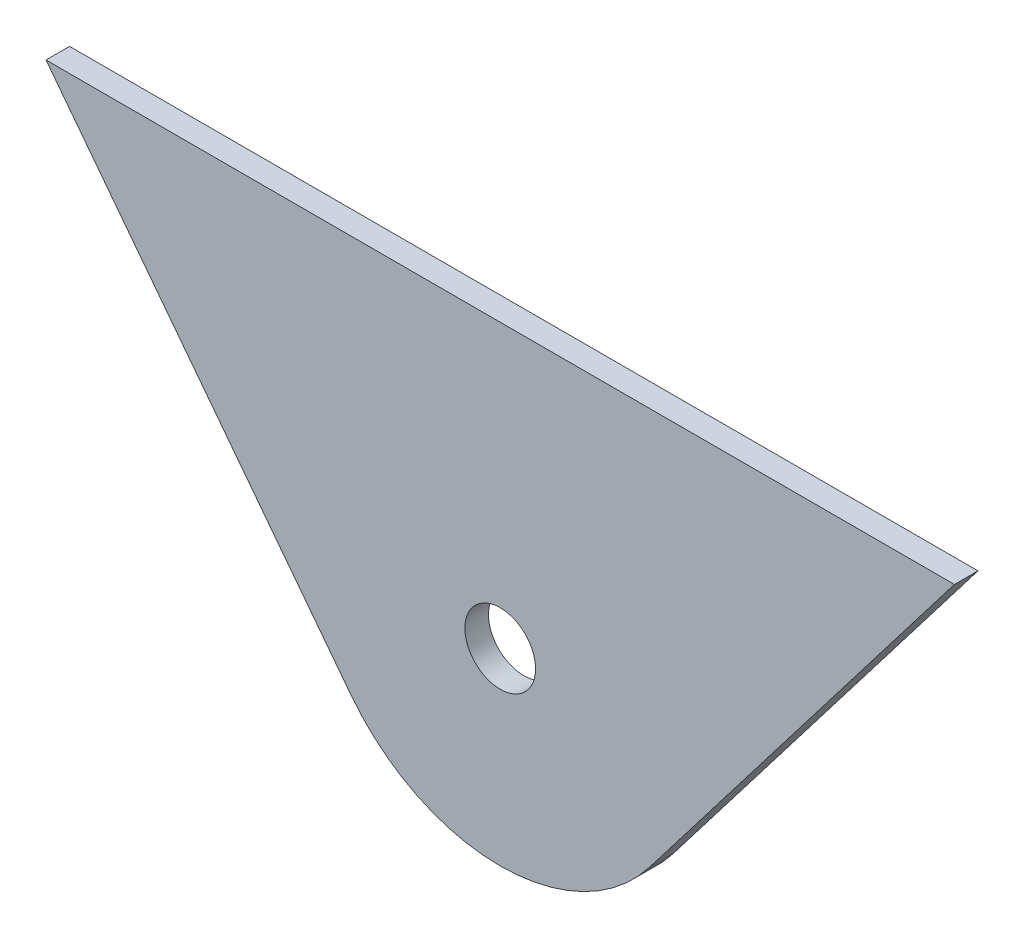
ISO-10303-21;
HEADER;
FILE_DESCRIPTION(('STEP AP214'),'2;1');
FILE_NAME('part.step','',(''),(''),'','','');
FILE_SCHEMA(('AUTOMOTIVE_DESIGN { 1 0 10303 214 1 1 1 1 }'));
ENDSEC;
DATA;
#1=APPLICATION_CONTEXT('core data for automotive mechanical design processes');
#2=APPLICATION_PROTOCOL_DEFINITION('international standard','automotive_design',2000,#1);
#3=PRODUCT_CONTEXT('',#1,'mechanical');
#4=PRODUCT('Part','Part','',(#3));
#5=PRODUCT_RELATED_PRODUCT_CATEGORY('part','',(#4));
#6=PRODUCT_DEFINITION_FORMATION('','',#4);
#7=PRODUCT_DEFINITION_CONTEXT('part definition',#1,'design');
#8=PRODUCT_DEFINITION('design','',#6,#7);
#9=PRODUCT_DEFINITION_SHAPE('','',#8);
#10=(LENGTH_UNIT() NAMED_UNIT(*) SI_UNIT(.MILLI.,.METRE.));
#11=(NAMED_UNIT(*) PLANE_ANGLE_UNIT() SI_UNIT($,.RADIAN.));
#12=(NAMED_UNIT(*) SI_UNIT($,.STERADIAN.) SOLID_ANGLE_UNIT());
#13=UNCERTAINTY_MEASURE_WITH_UNIT(LENGTH_MEASURE(1.E-05),#10,'distance_accuracy_value','');
#14=(GEOMETRIC_REPRESENTATION_CONTEXT(3) GLOBAL_UNCERTAINTY_ASSIGNED_CONTEXT((#13)) GLOBAL_UNIT_ASSIGNED_CONTEXT((#10,
#11,#12)) REPRESENTATION_CONTEXT('',''));
#15=CARTESIAN_POINT('',(0.,0.,0.));
#16=DIRECTION('',(0.,0.,1.));
#17=DIRECTION('',(1.,0.,0.));
#18=AXIS2_PLACEMENT_3D('',#15,#16,#17);
#19=CARTESIAN_POINT('',(0.,0.,3.175));
#20=DIRECTION('',(0.,0.,-1.));
#21=DIRECTION('',(-1.,0.,0.));
#22=AXIS2_PLACEMENT_3D('',#19,#20,#21);
#23=CYLINDRICAL_SURFACE('',#22,25.4);
#24=CARTESIAN_POINT('',(0.,0.,0.));
#25=DIRECTION('',(0.,0.,1.));
#26=DIRECTION('',(1.,0.,0.));
#27=AXIS2_PLACEMENT_3D('',#24,#25,#26);
#28=CIRCLE('',#27,25.4);
#29=CARTESIAN_POINT('',(-20.1511748433974,-15.4625402968215,0.));
#30=VERTEX_POINT('',#29);
#31=CARTESIAN_POINT('',(20.1511748433974,-15.4625402968215,0.));
#32=VERTEX_POINT('',#31);
#33=EDGE_CURVE('E98',#30,#32,#28,.T.);
#34=ORIENTED_EDGE('',*,*,#33,.T.);
#35=DIRECTION('',(0.,0.,-1.));
#36=VECTOR('',#35,1.);
#37=CARTESIAN_POINT('',(20.1511748433974,-15.4625402968215,3.175));
#38=LINE('',#37,#36);
#39=CARTESIAN_POINT('',(20.1511748433974,-15.4625402968215,3.175));
#40=VERTEX_POINT('',#39);
#41=EDGE_CURVE('E11',#40,#32,#38,.T.);
#42=ORIENTED_EDGE('',*,*,#41,.F.);
#43=CARTESIAN_POINT('',(0.,0.,3.175));
#44=DIRECTION('',(0.,0.,1.));
#45=DIRECTION('',(1.,0.,0.));
#46=AXIS2_PLACEMENT_3D('',#43,#44,#45);
#47=CIRCLE('',#46,25.4);
#48=CARTESIAN_POINT('',(-20.1511748433974,-15.4625402968215,3.175));
#49=VERTEX_POINT('',#48);
#50=EDGE_CURVE('E86',#49,#40,#47,.T.);
#51=ORIENTED_EDGE('',*,*,#50,.F.);
#52=DIRECTION('',(0.,0.,-1.));
#53=VECTOR('',#52,1.);
#54=CARTESIAN_POINT('',(-20.1511748433974,-15.4625402968215,3.175));
#55=LINE('',#54,#53);
#56=EDGE_CURVE('E94',#49,#30,#55,.T.);
#57=ORIENTED_EDGE('',*,*,#56,.T.);
#58=EDGE_LOOP('',(#34,#42,#51,#57));
#59=FACE_BOUND('',#58,.T.);
#60=ADVANCED_FACE('F35',(#59),#23,.T.);
#61=CARTESIAN_POINT('',(61.251157557859,38.1,3.175));
#62=DIRECTION('',(-0.793353340291236,0.608761429008719,0.));
#63=DIRECTION('',(-0.608761429008719,-0.793353340291236,0.));
#64=AXIS2_PLACEMENT_3D('',#61,#62,#63);
#65=PLANE('',#64);
#66=DIRECTION('',(0.608761429008719,0.793353340291236,0.));
#67=VECTOR('',#66,1.);
#68=CARTESIAN_POINT('',(61.251157557859,38.1,0.));
#69=LINE('',#68,#67);
#70=CARTESIAN_POINT('',(61.251157557859,38.1,0.));
#71=VERTEX_POINT('',#70);
#72=EDGE_CURVE('E90',#32,#71,#69,.T.);
#73=ORIENTED_EDGE('',*,*,#72,.T.);
#74=DIRECTION('',(0.,0.,-1.));
#75=VECTOR('',#74,1.);
#76=CARTESIAN_POINT('',(61.251157557859,38.1,3.175));
#77=LINE('',#76,#75);
#78=CARTESIAN_POINT('',(61.251157557859,38.1,3.175));
#79=VERTEX_POINT('',#78);
#80=EDGE_CURVE('E43',#79,#71,#77,.T.);
#81=ORIENTED_EDGE('',*,*,#80,.F.);
#82=DIRECTION('',(0.608761429008719,0.793353340291236,0.));
#83=VECTOR('',#82,1.);
#84=CARTESIAN_POINT('',(61.251157557859,38.1,3.175));
#85=LINE('',#84,#83);
#86=EDGE_CURVE('E81',#40,#79,#85,.T.);
#87=ORIENTED_EDGE('',*,*,#86,.F.);
#88=ORIENTED_EDGE('',*,*,#41,.T.);
#89=EDGE_LOOP('',(#73,#81,#87,#88));
#90=FACE_BOUND('',#89,.T.);
#91=ADVANCED_FACE('F89',(#90),#65,.F.);
#92=CARTESIAN_POINT('',(-61.251157557859,38.1,3.175));
#93=DIRECTION('',(0.,-1.,0.));
#94=DIRECTION('',(0.,0.,-1.));
#95=AXIS2_PLACEMENT_3D('',#92,#93,#94);
#96=PLANE('',#95);
#97=DIRECTION('',(-1.,0.,0.));
#98=VECTOR('',#97,1.);
#99=CARTESIAN_POINT('',(-61.251157557859,38.1,0.));
#100=LINE('',#99,#98);
#101=CARTESIAN_POINT('',(-61.251157557859,38.1,0.));
#102=VERTEX_POINT('',#101);
#103=EDGE_CURVE('E68',#71,#102,#100,.T.);
#104=ORIENTED_EDGE('',*,*,#103,.T.);
#105=DIRECTION('',(0.,0.,-1.));
#106=VECTOR('',#105,1.);
#107=CARTESIAN_POINT('',(-61.251157557859,38.1,3.175));
#108=LINE('',#107,#106);
#109=CARTESIAN_POINT('',(-61.251157557859,38.1,3.175));
#110=VERTEX_POINT('',#109);
#111=EDGE_CURVE('E91',#110,#102,#108,.T.);
#112=ORIENTED_EDGE('',*,*,#111,.F.);
#113=DIRECTION('',(-1.,0.,0.));
#114=VECTOR('',#113,1.);
#115=CARTESIAN_POINT('',(-61.251157557859,38.1,3.175));
#116=LINE('',#115,#114);
#117=EDGE_CURVE('E84',#79,#110,#116,.T.);
#118=ORIENTED_EDGE('',*,*,#117,.F.);
#119=ORIENTED_EDGE('',*,*,#80,.T.);
#120=EDGE_LOOP('',(#104,#112,#118,#119));
#121=FACE_BOUND('',#120,.T.);
#122=ADVANCED_FACE('F92',(#121),#96,.F.);
#123=CARTESIAN_POINT('',(-20.1511748433974,-15.4625402968215,3.175));
#124=DIRECTION('',(0.793353340291236,0.608761429008719,0.));
#125=DIRECTION('',(-0.608761429008719,0.793353340291236,0.));
#126=AXIS2_PLACEMENT_3D('',#123,#124,#125);
#127=PLANE('',#126);
#128=DIRECTION('',(0.608761429008719,-0.793353340291236,0.));
#129=VECTOR('',#128,1.);
#130=CARTESIAN_POINT('',(-20.1511748433974,-15.4625402968215,0.));
#131=LINE('',#130,#129);
#132=EDGE_CURVE('E74',#102,#30,#131,.T.);
#133=ORIENTED_EDGE('',*,*,#132,.T.);
#134=ORIENTED_EDGE('',*,*,#56,.F.);
#135=DIRECTION('',(0.608761429008719,-0.793353340291236,0.));
#136=VECTOR('',#135,1.);
#137=CARTESIAN_POINT('',(-20.1511748433974,-15.4625402968215,3.175));
#138=LINE('',#137,#136);
#139=EDGE_CURVE('E51',#110,#49,#138,.T.);
#140=ORIENTED_EDGE('',*,*,#139,.F.);
#141=ORIENTED_EDGE('',*,*,#111,.T.);
#142=EDGE_LOOP('',(#133,#134,#140,#141));
#143=FACE_BOUND('',#142,.T.);
#144=ADVANCED_FACE('F106',(#143),#127,.F.);
#145=CARTESIAN_POINT('',(0.,0.,3.175));
#146=DIRECTION('',(0.,0.,1.));
#147=DIRECTION('',(1.,0.,0.));
#148=AXIS2_PLACEMENT_3D('',#145,#146,#147);
#149=PLANE('',#148);
#150=CARTESIAN_POINT('',(0.,0.,3.175));
#151=DIRECTION('',(0.,0.,1.));
#152=DIRECTION('',(1.,0.,0.));
#153=AXIS2_PLACEMENT_3D('',#150,#151,#152);
#154=CIRCLE('',#153,4.7625);
#155=CARTESIAN_POINT('',(4.7625,0.,3.175));
#156=VERTEX_POINT('',#155);
#157=EDGE_CURVE('E112',#156,#156,#154,.T.);
#158=ORIENTED_EDGE('',*,*,#157,.F.);
#159=EDGE_LOOP('',(#158));
#160=FACE_BOUND('',#159,.T.);
#161=ORIENTED_EDGE('',*,*,#50,.T.);
#162=ORIENTED_EDGE('',*,*,#86,.T.);
#163=ORIENTED_EDGE('',*,*,#117,.T.);
#164=ORIENTED_EDGE('',*,*,#139,.T.);
#165=EDGE_LOOP('',(#161,#162,#163,#164));
#166=FACE_BOUND('',#165,.T.);
#167=ADVANCED_FACE('F82',(#160,#166),#149,.T.);
#168=CARTESIAN_POINT('',(0.,0.,0.));
#169=DIRECTION('',(0.,0.,1.));
#170=DIRECTION('',(1.,0.,0.));
#171=AXIS2_PLACEMENT_3D('',#168,#169,#170);
#172=PLANE('',#171);
#173=CARTESIAN_POINT('',(0.,0.,0.));
#174=DIRECTION('',(0.,0.,1.));
#175=DIRECTION('',(1.,0.,0.));
#176=AXIS2_PLACEMENT_3D('',#173,#174,#175);
#177=CIRCLE('',#176,4.7625);
#178=CARTESIAN_POINT('',(4.7625,0.,0.));
#179=VERTEX_POINT('',#178);
#180=EDGE_CURVE('E101',#179,#179,#177,.T.);
#181=ORIENTED_EDGE('',*,*,#180,.T.);
#182=EDGE_LOOP('',(#181));
#183=FACE_BOUND('',#182,.T.);
#184=ORIENTED_EDGE('',*,*,#33,.F.);
#185=ORIENTED_EDGE('',*,*,#132,.F.);
#186=ORIENTED_EDGE('',*,*,#103,.F.);
#187=ORIENTED_EDGE('',*,*,#72,.F.);
#188=EDGE_LOOP('',(#184,#185,#186,#187));
#189=FACE_BOUND('',#188,.T.);
#190=ADVANCED_FACE('F109',(#183,#189),#172,.F.);
#191=CARTESIAN_POINT('',(0.,0.,0.));
#192=DIRECTION('',(0.,0.,1.));
#193=DIRECTION('',(1.,0.,0.));
#194=AXIS2_PLACEMENT_3D('',#191,#192,#193);
#195=CYLINDRICAL_SURFACE('',#194,4.7625);
#196=ORIENTED_EDGE('',*,*,#180,.F.);
#197=EDGE_LOOP('',(#196));
#198=FACE_BOUND('',#197,.T.);
#199=ORIENTED_EDGE('',*,*,#157,.T.);
#200=EDGE_LOOP('',(#199));
#201=FACE_BOUND('',#200,.T.);
#202=ADVANCED_FACE('F119',(#198,#201),#195,.F.);
#203=CLOSED_SHELL('',(#60,#91,#122,#144,#167,#190,#202));
#204=MANIFOLD_SOLID_BREP('B2',#203);
#205=ADVANCED_BREP_SHAPE_REPRESENTATION('',(#18,#204),#14);
#206=SHAPE_DEFINITION_REPRESENTATION(#9,#205);
ENDSEC;
END-ISO-10303-21;
